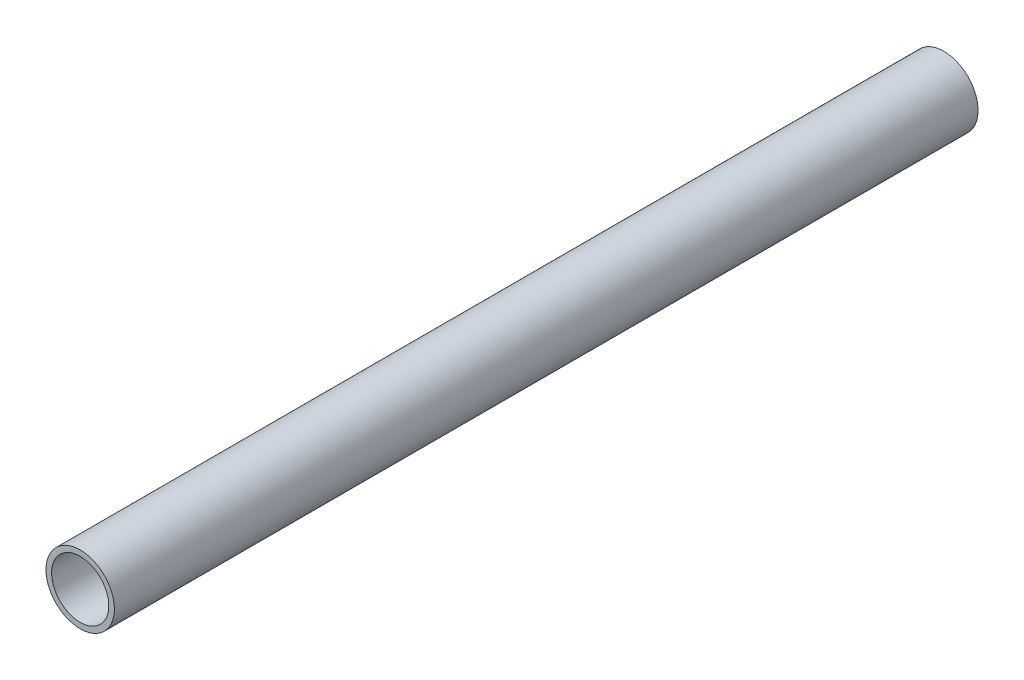
ISO-10303-21;
HEADER;
FILE_DESCRIPTION(('STEP AP214'),'2;1');
FILE_NAME('part.step','',(''),(''),'','','');
FILE_SCHEMA(('AUTOMOTIVE_DESIGN { 1 0 10303 214 1 1 1 1 }'));
ENDSEC;
DATA;
#1=APPLICATION_CONTEXT('core data for automotive mechanical design processes');
#2=APPLICATION_PROTOCOL_DEFINITION('international standard','automotive_design',2000,#1);
#3=PRODUCT_CONTEXT('',#1,'mechanical');
#4=PRODUCT('Part','Part','',(#3));
#5=PRODUCT_RELATED_PRODUCT_CATEGORY('part','',(#4));
#6=PRODUCT_DEFINITION_FORMATION('','',#4);
#7=PRODUCT_DEFINITION_CONTEXT('part definition',#1,'design');
#8=PRODUCT_DEFINITION('design','',#6,#7);
#9=PRODUCT_DEFINITION_SHAPE('','',#8);
#10=(LENGTH_UNIT() NAMED_UNIT(*) SI_UNIT(.MILLI.,.METRE.));
#11=(NAMED_UNIT(*) PLANE_ANGLE_UNIT() SI_UNIT($,.RADIAN.));
#12=(NAMED_UNIT(*) SI_UNIT($,.STERADIAN.) SOLID_ANGLE_UNIT());
#13=UNCERTAINTY_MEASURE_WITH_UNIT(LENGTH_MEASURE(1.E-05),#10,'distance_accuracy_value','');
#14=(GEOMETRIC_REPRESENTATION_CONTEXT(3) GLOBAL_UNCERTAINTY_ASSIGNED_CONTEXT((#13)) GLOBAL_UNIT_ASSIGNED_CONTEXT((#10,
#11,#12)) REPRESENTATION_CONTEXT('',''));
#15=CARTESIAN_POINT('',(0.,0.,0.));
#16=DIRECTION('',(0.,0.,1.));
#17=DIRECTION('',(1.,0.,0.));
#18=AXIS2_PLACEMENT_3D('',#15,#16,#17);
#19=CARTESIAN_POINT('',(0.,0.,609.6));
#20=DIRECTION('',(0.,0.,1.));
#21=DIRECTION('',(1.,0.,0.));
#22=AXIS2_PLACEMENT_3D('',#19,#20,#21);
#23=PLANE('',#22);
#24=CARTESIAN_POINT('',(0.,0.,609.6));
#25=DIRECTION('',(0.,0.,1.));
#26=DIRECTION('',(1.,0.,0.));
#27=AXIS2_PLACEMENT_3D('',#24,#25,#26);
#28=CIRCLE('',#27,24.13);
#29=CARTESIAN_POINT('',(-24.13,0.,609.6));
#30=VERTEX_POINT('',#29);
#31=EDGE_CURVE('E10',#30,#30,#28,.T.);
#32=ORIENTED_EDGE('',*,*,#31,.T.);
#33=EDGE_LOOP('',(#32));
#34=FACE_BOUND('',#33,.T.);
#35=CARTESIAN_POINT('',(0.,0.,609.6));
#36=DIRECTION('',(0.,0.,1.));
#37=DIRECTION('',(1.,0.,0.));
#38=AXIS2_PLACEMENT_3D('',#35,#36,#37);
#39=CIRCLE('',#38,20.193);
#40=CARTESIAN_POINT('',(-20.193,0.,609.6));
#41=VERTEX_POINT('',#40);
#42=EDGE_CURVE('E42',#41,#41,#39,.T.);
#43=ORIENTED_EDGE('',*,*,#42,.F.);
#44=EDGE_LOOP('',(#43));
#45=FACE_BOUND('',#44,.T.);
#46=ADVANCED_FACE('F31',(#34,#45),#23,.T.);
#47=CARTESIAN_POINT('',(0.,0.,0.));
#48=DIRECTION('',(0.,0.,1.));
#49=DIRECTION('',(1.,0.,0.));
#50=AXIS2_PLACEMENT_3D('',#47,#48,#49);
#51=PLANE('',#50);
#52=CARTESIAN_POINT('',(0.,0.,0.));
#53=DIRECTION('',(0.,0.,1.));
#54=DIRECTION('',(1.,0.,0.));
#55=AXIS2_PLACEMENT_3D('',#52,#53,#54);
#56=CIRCLE('',#55,24.13);
#57=CARTESIAN_POINT('',(-24.13,0.,0.));
#58=VERTEX_POINT('',#57);
#59=EDGE_CURVE('E35',#58,#58,#56,.T.);
#60=ORIENTED_EDGE('',*,*,#59,.F.);
#61=EDGE_LOOP('',(#60));
#62=FACE_BOUND('',#61,.T.);
#63=CARTESIAN_POINT('',(0.,0.,0.));
#64=DIRECTION('',(0.,0.,1.));
#65=DIRECTION('',(1.,0.,0.));
#66=AXIS2_PLACEMENT_3D('',#63,#64,#65);
#67=CIRCLE('',#66,20.193);
#68=CARTESIAN_POINT('',(-20.193,0.,0.));
#69=VERTEX_POINT('',#68);
#70=EDGE_CURVE('E44',#69,#69,#67,.T.);
#71=ORIENTED_EDGE('',*,*,#70,.T.);
#72=EDGE_LOOP('',(#71));
#73=FACE_BOUND('',#72,.T.);
#74=ADVANCED_FACE('F54',(#62,#73),#51,.F.);
#75=CARTESIAN_POINT('',(0.,0.,609.6));
#76=DIRECTION('',(0.,0.,-1.));
#77=DIRECTION('',(-1.,0.,0.));
#78=AXIS2_PLACEMENT_3D('',#75,#76,#77);
#79=CYLINDRICAL_SURFACE('',#78,24.13);
#80=CARTESIAN_POINT('',(-24.13,0.,609.6));
#81=CARTESIAN_POINT('',(-24.13,0.,603.25));
#82=CARTESIAN_POINT('',(-24.13,0.,596.9));
#83=CARTESIAN_POINT('',(-24.13,0.,584.2));
#84=CARTESIAN_POINT('',(-24.13,0.,577.85));
#85=CARTESIAN_POINT('',(-24.13,0.,565.15));
#86=CARTESIAN_POINT('',(-24.13,0.,558.8));
#87=CARTESIAN_POINT('',(-24.13,0.,546.1));
#88=CARTESIAN_POINT('',(-24.13,0.,539.75));
#89=CARTESIAN_POINT('',(-24.13,0.,527.05));
#90=CARTESIAN_POINT('',(-24.13,0.,520.7));
#91=CARTESIAN_POINT('',(-24.13,0.,508.));
#92=CARTESIAN_POINT('',(-24.13,0.,501.65));
#93=CARTESIAN_POINT('',(-24.13,0.,488.95));
#94=CARTESIAN_POINT('',(-24.13,0.,482.6));
#95=CARTESIAN_POINT('',(-24.13,0.,469.9));
#96=CARTESIAN_POINT('',(-24.13,0.,463.55));
#97=CARTESIAN_POINT('',(-24.13,0.,450.85));
#98=CARTESIAN_POINT('',(-24.13,0.,444.5));
#99=CARTESIAN_POINT('',(-24.13,0.,431.8));
#100=CARTESIAN_POINT('',(-24.13,0.,425.45));
#101=CARTESIAN_POINT('',(-24.13,0.,412.75));
#102=CARTESIAN_POINT('',(-24.13,0.,406.4));
#103=CARTESIAN_POINT('',(-24.13,0.,393.7));
#104=CARTESIAN_POINT('',(-24.13,0.,387.35));
#105=CARTESIAN_POINT('',(-24.13,0.,374.65));
#106=CARTESIAN_POINT('',(-24.13,0.,368.3));
#107=CARTESIAN_POINT('',(-24.13,0.,355.6));
#108=CARTESIAN_POINT('',(-24.13,0.,349.25));
#109=CARTESIAN_POINT('',(-24.13,0.,336.55));
#110=CARTESIAN_POINT('',(-24.13,0.,330.2));
#111=CARTESIAN_POINT('',(-24.13,0.,317.5));
#112=CARTESIAN_POINT('',(-24.13,0.,311.15));
#113=CARTESIAN_POINT('',(-24.13,0.,298.45));
#114=CARTESIAN_POINT('',(-24.13,0.,292.1));
#115=CARTESIAN_POINT('',(-24.13,0.,279.4));
#116=CARTESIAN_POINT('',(-24.13,0.,273.05));
#117=CARTESIAN_POINT('',(-24.13,0.,260.35));
#118=CARTESIAN_POINT('',(-24.13,0.,254.));
#119=CARTESIAN_POINT('',(-24.13,0.,241.3));
#120=CARTESIAN_POINT('',(-24.13,0.,234.95));
#121=CARTESIAN_POINT('',(-24.13,0.,222.25));
#122=CARTESIAN_POINT('',(-24.13,0.,215.9));
#123=CARTESIAN_POINT('',(-24.13,0.,203.2));
#124=CARTESIAN_POINT('',(-24.13,0.,196.85));
#125=CARTESIAN_POINT('',(-24.13,0.,184.15));
#126=CARTESIAN_POINT('',(-24.13,0.,177.8));
#127=CARTESIAN_POINT('',(-24.13,0.,165.1));
#128=CARTESIAN_POINT('',(-24.13,0.,158.75));
#129=CARTESIAN_POINT('',(-24.13,0.,146.05));
#130=CARTESIAN_POINT('',(-24.13,0.,139.7));
#131=CARTESIAN_POINT('',(-24.13,0.,127.));
#132=CARTESIAN_POINT('',(-24.13,0.,120.65));
#133=CARTESIAN_POINT('',(-24.13,0.,107.95));
#134=CARTESIAN_POINT('',(-24.13,0.,101.6));
#135=CARTESIAN_POINT('',(-24.13,0.,88.9));
#136=CARTESIAN_POINT('',(-24.13,0.,82.5500000000001));
#137=CARTESIAN_POINT('',(-24.13,0.,69.85));
#138=CARTESIAN_POINT('',(-24.13,0.,63.5));
#139=CARTESIAN_POINT('',(-24.13,0.,50.8));
#140=CARTESIAN_POINT('',(-24.13,0.,44.45));
#141=CARTESIAN_POINT('',(-24.13,0.,31.75));
#142=CARTESIAN_POINT('',(-24.13,0.,25.4));
#143=CARTESIAN_POINT('',(-24.13,0.,12.7));
#144=CARTESIAN_POINT('',(-24.13,0.,6.35000000000001));
#145=CARTESIAN_POINT('',(-24.13,0.,0.));
#146=B_SPLINE_CURVE_WITH_KNOTS('',3,(#80,#81,#82,#83,#84,#85,#86,#87,#88,#89,#90,#91,#92,#93,
#94,#95,#96,#97,#98,#99,#100,#101,#102,#103,#104,#105,#106,#107,#108,#109,#110,#111,#112,#113,
#114,#115,#116,#117,#118,#119,#120,#121,#122,#123,#124,#125,#126,#127,#128,#129,#130,#131,#132,
#133,#134,#135,#136,#137,#138,#139,#140,#141,#142,#143,#144,#145),.UNSPECIFIED.,.F.,.F.,(4,2,2,
2,2,2,2,2,2,2,2,2,2,2,2,2,2,2,2,2,2,2,2,2,2,2,2,2,2,2,2,2,4),(0.,19.05,38.1,57.15,76.2,
95.2500000000001,114.3,133.35,152.4,171.45,190.5,209.55,228.6,247.65,266.7,285.75,304.8,323.85,
342.9,361.95,381.,400.05,419.1,438.15,457.2,476.25,495.3,514.35,533.4,552.45,571.5,590.55,
609.6),.UNSPECIFIED.);
#147=EDGE_CURVE('BSEAM33',#30,#58,#146,.T.);
#148=ORIENTED_EDGE('',*,*,#31,.F.);
#149=ORIENTED_EDGE('',*,*,#59,.T.);
#150=ORIENTED_EDGE('',*,*,#147,.T.);
#151=ORIENTED_EDGE('',*,*,#147,.F.);
#152=EDGE_LOOP('',(#148,#150,#149,#151));
#153=FACE_BOUND('',#152,.T.);
#154=ADVANCED_FACE('F33',(#153),#79,.T.);
#155=CARTESIAN_POINT('',(0.,0.,609.6));
#156=DIRECTION('',(0.,0.,-1.));
#157=DIRECTION('',(-1.,0.,0.));
#158=AXIS2_PLACEMENT_3D('',#155,#156,#157);
#159=CYLINDRICAL_SURFACE('',#158,20.193);
#160=CARTESIAN_POINT('',(-20.193,0.,609.6));
#161=CARTESIAN_POINT('',(-20.193,0.,603.25));
#162=CARTESIAN_POINT('',(-20.193,0.,596.9));
#163=CARTESIAN_POINT('',(-20.193,0.,584.2));
#164=CARTESIAN_POINT('',(-20.193,0.,577.85));
#165=CARTESIAN_POINT('',(-20.193,0.,565.15));
#166=CARTESIAN_POINT('',(-20.193,0.,558.8));
#167=CARTESIAN_POINT('',(-20.193,0.,546.1));
#168=CARTESIAN_POINT('',(-20.193,0.,539.75));
#169=CARTESIAN_POINT('',(-20.193,0.,527.05));
#170=CARTESIAN_POINT('',(-20.193,0.,520.7));
#171=CARTESIAN_POINT('',(-20.193,0.,508.));
#172=CARTESIAN_POINT('',(-20.193,0.,501.65));
#173=CARTESIAN_POINT('',(-20.193,0.,488.95));
#174=CARTESIAN_POINT('',(-20.193,0.,482.6));
#175=CARTESIAN_POINT('',(-20.193,0.,469.9));
#176=CARTESIAN_POINT('',(-20.193,0.,463.55));
#177=CARTESIAN_POINT('',(-20.193,0.,450.85));
#178=CARTESIAN_POINT('',(-20.193,0.,444.5));
#179=CARTESIAN_POINT('',(-20.193,0.,431.8));
#180=CARTESIAN_POINT('',(-20.193,0.,425.45));
#181=CARTESIAN_POINT('',(-20.193,0.,412.75));
#182=CARTESIAN_POINT('',(-20.193,0.,406.4));
#183=CARTESIAN_POINT('',(-20.193,0.,393.7));
#184=CARTESIAN_POINT('',(-20.193,0.,387.35));
#185=CARTESIAN_POINT('',(-20.193,0.,374.65));
#186=CARTESIAN_POINT('',(-20.193,0.,368.3));
#187=CARTESIAN_POINT('',(-20.193,0.,355.6));
#188=CARTESIAN_POINT('',(-20.193,0.,349.25));
#189=CARTESIAN_POINT('',(-20.193,0.,336.55));
#190=CARTESIAN_POINT('',(-20.193,0.,330.2));
#191=CARTESIAN_POINT('',(-20.193,0.,317.5));
#192=CARTESIAN_POINT('',(-20.193,0.,311.15));
#193=CARTESIAN_POINT('',(-20.193,0.,298.45));
#194=CARTESIAN_POINT('',(-20.193,0.,292.1));
#195=CARTESIAN_POINT('',(-20.193,0.,279.4));
#196=CARTESIAN_POINT('',(-20.193,0.,273.05));
#197=CARTESIAN_POINT('',(-20.193,0.,260.35));
#198=CARTESIAN_POINT('',(-20.193,0.,254.));
#199=CARTESIAN_POINT('',(-20.193,0.,241.3));
#200=CARTESIAN_POINT('',(-20.193,0.,234.95));
#201=CARTESIAN_POINT('',(-20.193,0.,222.25));
#202=CARTESIAN_POINT('',(-20.193,0.,215.9));
#203=CARTESIAN_POINT('',(-20.193,0.,203.2));
#204=CARTESIAN_POINT('',(-20.193,0.,196.85));
#205=CARTESIAN_POINT('',(-20.193,0.,184.15));
#206=CARTESIAN_POINT('',(-20.193,0.,177.8));
#207=CARTESIAN_POINT('',(-20.193,0.,165.1));
#208=CARTESIAN_POINT('',(-20.193,0.,158.75));
#209=CARTESIAN_POINT('',(-20.193,0.,146.05));
#210=CARTESIAN_POINT('',(-20.193,0.,139.7));
#211=CARTESIAN_POINT('',(-20.193,0.,127.));
#212=CARTESIAN_POINT('',(-20.193,0.,120.65));
#213=CARTESIAN_POINT('',(-20.193,0.,107.95));
#214=CARTESIAN_POINT('',(-20.193,0.,101.6));
#215=CARTESIAN_POINT('',(-20.193,0.,88.9));
#216=CARTESIAN_POINT('',(-20.193,0.,82.5500000000001));
#217=CARTESIAN_POINT('',(-20.193,0.,69.85));
#218=CARTESIAN_POINT('',(-20.193,0.,63.5));
#219=CARTESIAN_POINT('',(-20.193,0.,50.8));
#220=CARTESIAN_POINT('',(-20.193,0.,44.45));
#221=CARTESIAN_POINT('',(-20.193,0.,31.75));
#222=CARTESIAN_POINT('',(-20.193,0.,25.4));
#223=CARTESIAN_POINT('',(-20.193,0.,12.7));
#224=CARTESIAN_POINT('',(-20.193,0.,6.35000000000001));
#225=CARTESIAN_POINT('',(-20.193,0.,0.));
#226=B_SPLINE_CURVE_WITH_KNOTS('',3,(#160,#161,#162,#163,#164,#165,#166,#167,#168,#169,#170,
#171,#172,#173,#174,#175,#176,#177,#178,#179,#180,#181,#182,#183,#184,#185,#186,#187,#188,#189,
#190,#191,#192,#193,#194,#195,#196,#197,#198,#199,#200,#201,#202,#203,#204,#205,#206,#207,#208,
#209,#210,#211,#212,#213,#214,#215,#216,#217,#218,#219,#220,#221,#222,#223,#224,#225),
.UNSPECIFIED.,.F.,.F.,(4,2,2,2,2,2,2,2,2,2,2,2,2,2,2,2,2,2,2,2,2,2,2,2,2,2,2,2,2,2,2,2,4),(0.,
19.0499999999999,38.0999999999999,57.1499999999999,76.1999999999999,95.2499999999999,114.3,
133.35,152.4,171.45,190.5,209.55,228.6,247.65,266.7,285.75,304.8,323.85,342.9,361.95,381.,
400.05,419.1,438.15,457.2,476.25,495.3,514.35,533.4,552.45,571.5,590.55,609.6),.UNSPECIFIED.);
#227=EDGE_CURVE('BSEAM50',#41,#69,#226,.T.);
#228=ORIENTED_EDGE('',*,*,#42,.T.);
#229=ORIENTED_EDGE('',*,*,#70,.F.);
#230=ORIENTED_EDGE('',*,*,#227,.T.);
#231=ORIENTED_EDGE('',*,*,#227,.F.);
#232=EDGE_LOOP('',(#228,#230,#229,#231));
#233=FACE_BOUND('',#232,.T.);
#234=ADVANCED_FACE('F50',(#233),#159,.F.);
#235=CLOSED_SHELL('',(#46,#74,#154,#234));
#236=MANIFOLD_SOLID_BREP('B2',#235);
#237=ADVANCED_BREP_SHAPE_REPRESENTATION('',(#18,#236),#14);
#238=SHAPE_DEFINITION_REPRESENTATION(#9,#237);
ENDSEC;
END-ISO-10303-21;
